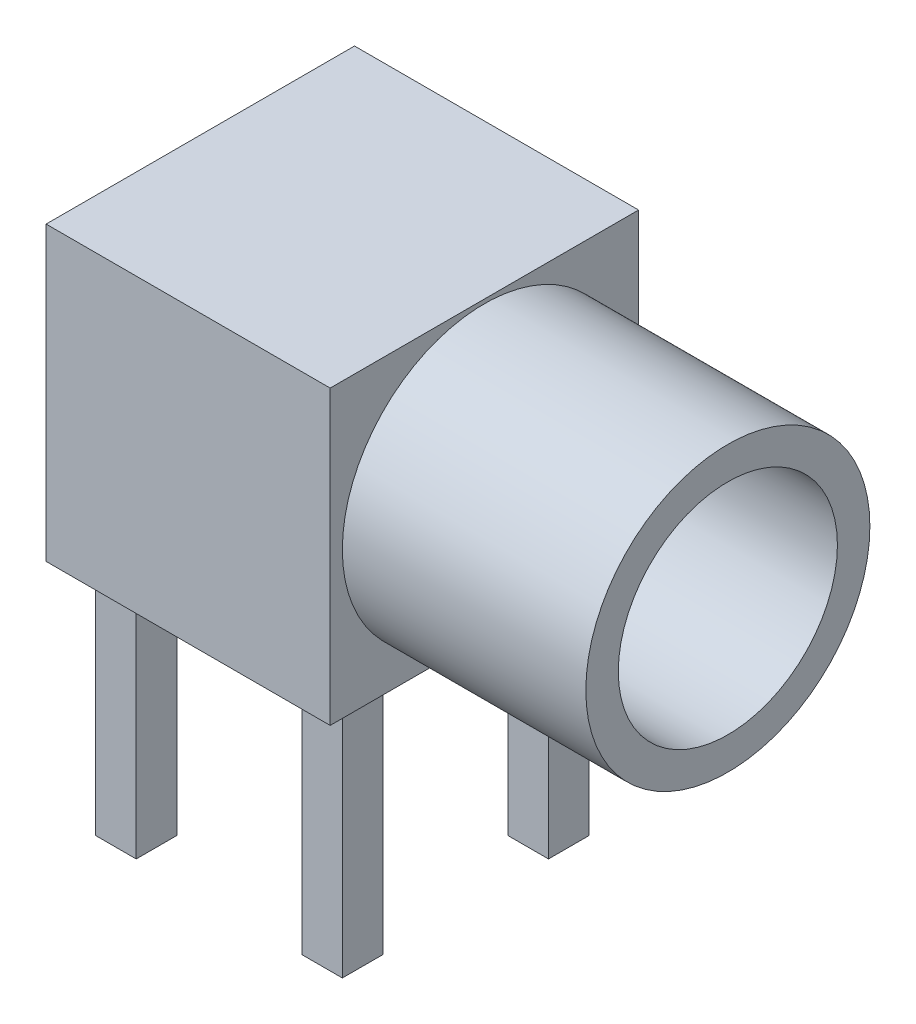
ISO-10303-21;
HEADER;
FILE_DESCRIPTION(('STEP AP214'),'2;1');
FILE_NAME('part.step','',(''),(''),'','','');
FILE_SCHEMA(('AUTOMOTIVE_DESIGN { 1 0 10303 214 1 1 1 1 }'));
ENDSEC;
DATA;
#1=APPLICATION_CONTEXT('core data for automotive mechanical design processes');
#2=APPLICATION_PROTOCOL_DEFINITION('international standard','automotive_design',2000,#1);
#3=PRODUCT_CONTEXT('',#1,'mechanical');
#4=PRODUCT('Part','Part','',(#3));
#5=PRODUCT_RELATED_PRODUCT_CATEGORY('part','',(#4));
#6=PRODUCT_DEFINITION_FORMATION('','',#4);
#7=PRODUCT_DEFINITION_CONTEXT('part definition',#1,'design');
#8=PRODUCT_DEFINITION('design','',#6,#7);
#9=PRODUCT_DEFINITION_SHAPE('','',#8);
#10=(LENGTH_UNIT() NAMED_UNIT(*) SI_UNIT(.MILLI.,.METRE.));
#11=(NAMED_UNIT(*) PLANE_ANGLE_UNIT() SI_UNIT($,.RADIAN.));
#12=(NAMED_UNIT(*) SI_UNIT($,.STERADIAN.) SOLID_ANGLE_UNIT());
#13=UNCERTAINTY_MEASURE_WITH_UNIT(LENGTH_MEASURE(1.E-05),#10,'distance_accuracy_value','');
#14=(GEOMETRIC_REPRESENTATION_CONTEXT(3) GLOBAL_UNCERTAINTY_ASSIGNED_CONTEXT((#13)) GLOBAL_UNIT_ASSIGNED_CONTEXT((#10,
#11,#12)) REPRESENTATION_CONTEXT('',''));
#15=CARTESIAN_POINT('',(0.,0.,0.));
#16=DIRECTION('',(0.,0.,1.));
#17=DIRECTION('',(1.,0.,0.));
#18=AXIS2_PLACEMENT_3D('',#15,#16,#17);
#19=CARTESIAN_POINT('',(0.,0.,0.));
#20=DIRECTION('',(0.,1.,0.));
#21=DIRECTION('',(0.,0.,1.));
#22=AXIS2_PLACEMENT_3D('',#19,#20,#21);
#23=PLANE('',#22);
#24=DIRECTION('',(0.,0.,-1.));
#25=VECTOR('',#24,1.);
#26=CARTESIAN_POINT('',(1.02,0.,1.52));
#27=LINE('',#26,#25);
#28=CARTESIAN_POINT('',(1.02,0.,1.52));
#29=VERTEX_POINT('',#28);
#30=CARTESIAN_POINT('',(1.02,0.,1.02));
#31=VERTEX_POINT('',#30);
#32=EDGE_CURVE('E204',#29,#31,#27,.T.);
#33=ORIENTED_EDGE('',*,*,#32,.F.);
#34=DIRECTION('',(-1.,0.,0.));
#35=VECTOR('',#34,1.);
#36=CARTESIAN_POINT('',(1.02,0.,1.52));
#37=LINE('',#36,#35);
#38=CARTESIAN_POINT('',(1.52,0.,1.52));
#39=VERTEX_POINT('',#38);
#40=EDGE_CURVE('E217',#39,#29,#37,.T.);
#41=ORIENTED_EDGE('',*,*,#40,.F.);
#42=DIRECTION('',(0.,0.,1.));
#43=VECTOR('',#42,1.);
#44=CARTESIAN_POINT('',(1.52,0.,1.52));
#45=LINE('',#44,#43);
#46=CARTESIAN_POINT('',(1.52,0.,1.02));
#47=VERTEX_POINT('',#46);
#48=EDGE_CURVE('E226',#47,#39,#45,.T.);
#49=ORIENTED_EDGE('',*,*,#48,.F.);
#50=DIRECTION('',(1.,0.,0.));
#51=VECTOR('',#50,1.);
#52=CARTESIAN_POINT('',(1.02,0.,1.02));
#53=LINE('',#52,#51);
#54=EDGE_CURVE('E207',#31,#47,#53,.T.);
#55=ORIENTED_EDGE('',*,*,#54,.F.);
#56=EDGE_LOOP('',(#33,#41,#49,#55));
#57=FACE_BOUND('',#56,.T.);
#58=DIRECTION('',(0.,0.,-1.));
#59=VECTOR('',#58,1.);
#60=CARTESIAN_POINT('',(-1.52,0.,1.52));
#61=LINE('',#60,#59);
#62=CARTESIAN_POINT('',(-1.52,0.,1.52));
#63=VERTEX_POINT('',#62);
#64=CARTESIAN_POINT('',(-1.52,0.,1.02));
#65=VERTEX_POINT('',#64);
#66=EDGE_CURVE('E275',#63,#65,#61,.T.);
#67=ORIENTED_EDGE('',*,*,#66,.F.);
#68=DIRECTION('',(-1.,0.,0.));
#69=VECTOR('',#68,1.);
#70=CARTESIAN_POINT('',(-1.52,0.,1.52));
#71=LINE('',#70,#69);
#72=CARTESIAN_POINT('',(-1.02,0.,1.52));
#73=VERTEX_POINT('',#72);
#74=EDGE_CURVE('E280',#73,#63,#71,.T.);
#75=ORIENTED_EDGE('',*,*,#74,.F.);
#76=DIRECTION('',(0.,0.,1.));
#77=VECTOR('',#76,1.);
#78=CARTESIAN_POINT('',(-1.02,0.,1.52));
#79=LINE('',#78,#77);
#80=CARTESIAN_POINT('',(-1.02,0.,1.02));
#81=VERTEX_POINT('',#80);
#82=EDGE_CURVE('E292',#81,#73,#79,.T.);
#83=ORIENTED_EDGE('',*,*,#82,.F.);
#84=DIRECTION('',(1.,0.,0.));
#85=VECTOR('',#84,1.);
#86=CARTESIAN_POINT('',(-1.52,0.,1.02));
#87=LINE('',#86,#85);
#88=EDGE_CURVE('E289',#65,#81,#87,.T.);
#89=ORIENTED_EDGE('',*,*,#88,.F.);
#90=EDGE_LOOP('',(#67,#75,#83,#89));
#91=FACE_BOUND('',#90,.T.);
#92=DIRECTION('',(0.,0.,-1.));
#93=VECTOR('',#92,1.);
#94=CARTESIAN_POINT('',(1.75,0.,-1.9));
#95=LINE('',#94,#93);
#96=CARTESIAN_POINT('',(1.75,0.,1.9));
#97=VERTEX_POINT('',#96);
#98=CARTESIAN_POINT('',(1.75,0.,-1.9));
#99=VERTEX_POINT('',#98);
#100=EDGE_CURVE('E317',#97,#99,#95,.T.);
#101=ORIENTED_EDGE('',*,*,#100,.F.);
#102=DIRECTION('',(1.,0.,0.));
#103=VECTOR('',#102,1.);
#104=CARTESIAN_POINT('',(-1.75,0.,1.9));
#105=LINE('',#104,#103);
#106=CARTESIAN_POINT('',(-1.75,0.,1.9));
#107=VERTEX_POINT('',#106);
#108=EDGE_CURVE('E322',#107,#97,#105,.T.);
#109=ORIENTED_EDGE('',*,*,#108,.F.);
#110=DIRECTION('',(0.,0.,1.));
#111=VECTOR('',#110,1.);
#112=CARTESIAN_POINT('',(-1.75,0.,-1.9));
#113=LINE('',#112,#111);
#114=CARTESIAN_POINT('',(-1.75,0.,-1.9));
#115=VERTEX_POINT('',#114);
#116=EDGE_CURVE('E333',#115,#107,#113,.T.);
#117=ORIENTED_EDGE('',*,*,#116,.F.);
#118=DIRECTION('',(-1.,0.,0.));
#119=VECTOR('',#118,1.);
#120=CARTESIAN_POINT('',(-1.75,0.,-1.9));
#121=LINE('',#120,#119);
#122=EDGE_CURVE('E331',#99,#115,#121,.T.);
#123=ORIENTED_EDGE('',*,*,#122,.F.);
#124=EDGE_LOOP('',(#101,#109,#117,#123));
#125=FACE_BOUND('',#124,.T.);
#126=DIRECTION('',(0.,0.,-1.));
#127=VECTOR('',#126,1.);
#128=CARTESIAN_POINT('',(-1.52,0.,-1.02));
#129=LINE('',#128,#127);
#130=CARTESIAN_POINT('',(-1.52,0.,-1.02));
#131=VERTEX_POINT('',#130);
#132=CARTESIAN_POINT('',(-1.52,0.,-1.52));
#133=VERTEX_POINT('',#132);
#134=EDGE_CURVE('E242',#131,#133,#129,.T.);
#135=ORIENTED_EDGE('',*,*,#134,.F.);
#136=DIRECTION('',(-1.,0.,0.));
#137=VECTOR('',#136,1.);
#138=CARTESIAN_POINT('',(-1.52,0.,-1.02));
#139=LINE('',#138,#137);
#140=CARTESIAN_POINT('',(-1.02,0.,-1.02));
#141=VERTEX_POINT('',#140);
#142=EDGE_CURVE('E247',#141,#131,#139,.T.);
#143=ORIENTED_EDGE('',*,*,#142,.F.);
#144=DIRECTION('',(0.,0.,1.));
#145=VECTOR('',#144,1.);
#146=CARTESIAN_POINT('',(-1.02,0.,-1.02));
#147=LINE('',#146,#145);
#148=CARTESIAN_POINT('',(-1.02,0.,-1.52));
#149=VERTEX_POINT('',#148);
#150=EDGE_CURVE('E259',#149,#141,#147,.T.);
#151=ORIENTED_EDGE('',*,*,#150,.F.);
#152=DIRECTION('',(1.,0.,0.));
#153=VECTOR('',#152,1.);
#154=CARTESIAN_POINT('',(-1.52,0.,-1.52));
#155=LINE('',#154,#153);
#156=EDGE_CURVE('E256',#133,#149,#155,.T.);
#157=ORIENTED_EDGE('',*,*,#156,.F.);
#158=EDGE_LOOP('',(#135,#143,#151,#157));
#159=FACE_BOUND('',#158,.T.);
#160=DIRECTION('',(0.,0.,-1.));
#161=VECTOR('',#160,1.);
#162=CARTESIAN_POINT('',(1.02,0.,-1.02));
#163=LINE('',#162,#161);
#164=CARTESIAN_POINT('',(1.02,0.,-1.02));
#165=VERTEX_POINT('',#164);
#166=CARTESIAN_POINT('',(1.02,0.,-1.52));
#167=VERTEX_POINT('',#166);
#168=EDGE_CURVE('E203',#165,#167,#163,.T.);
#169=ORIENTED_EDGE('',*,*,#168,.F.);
#170=DIRECTION('',(-1.,0.,0.));
#171=VECTOR('',#170,1.);
#172=CARTESIAN_POINT('',(1.02,0.,-1.02));
#173=LINE('',#172,#171);
#174=CARTESIAN_POINT('',(1.52,0.,-1.02));
#175=VERTEX_POINT('',#174);
#176=EDGE_CURVE('E200',#175,#165,#173,.T.);
#177=ORIENTED_EDGE('',*,*,#176,.F.);
#178=DIRECTION('',(0.,0.,1.));
#179=VECTOR('',#178,1.);
#180=CARTESIAN_POINT('',(1.52,0.,-1.02));
#181=LINE('',#180,#179);
#182=CARTESIAN_POINT('',(1.52,0.,-1.52));
#183=VERTEX_POINT('',#182);
#184=EDGE_CURVE('E66',#183,#175,#181,.T.);
#185=ORIENTED_EDGE('',*,*,#184,.F.);
#186=DIRECTION('',(1.,0.,0.));
#187=VECTOR('',#186,1.);
#188=CARTESIAN_POINT('',(1.02,0.,-1.52));
#189=LINE('',#188,#187);
#190=EDGE_CURVE('E61',#167,#183,#189,.T.);
#191=ORIENTED_EDGE('',*,*,#190,.F.);
#192=EDGE_LOOP('',(#169,#177,#185,#191));
#193=FACE_BOUND('',#192,.T.);
#194=ADVANCED_FACE('F46',(#57,#91,#125,#159,#193),#23,.F.);
#195=CARTESIAN_POINT('',(1.75,3.6,-1.9));
#196=DIRECTION('',(-1.,0.,0.));
#197=DIRECTION('',(0.,0.,1.));
#198=AXIS2_PLACEMENT_3D('',#195,#196,#197);
#199=PLANE('',#198);
#200=CARTESIAN_POINT('',(1.75,1.8,0.));
#201=DIRECTION('',(-1.,0.,0.));
#202=DIRECTION('',(0.,0.,1.));
#203=AXIS2_PLACEMENT_3D('',#200,#201,#202);
#204=CIRCLE('',#203,1.75);
#205=CARTESIAN_POINT('',(1.75,1.8,1.75));
#206=VERTEX_POINT('',#205);
#207=EDGE_CURVE('E13',#206,#206,#204,.F.);
#208=ORIENTED_EDGE('',*,*,#207,.F.);
#209=EDGE_LOOP('',(#208));
#210=FACE_BOUND('',#209,.T.);
#211=ORIENTED_EDGE('',*,*,#100,.T.);
#212=DIRECTION('',(0.,-1.,0.));
#213=VECTOR('',#212,1.);
#214=CARTESIAN_POINT('',(1.75,3.6,-1.9));
#215=LINE('',#214,#213);
#216=CARTESIAN_POINT('',(1.75,3.6,-1.9));
#217=VERTEX_POINT('',#216);
#218=EDGE_CURVE('E54',#217,#99,#215,.T.);
#219=ORIENTED_EDGE('',*,*,#218,.F.);
#220=DIRECTION('',(0.,0.,-1.));
#221=VECTOR('',#220,1.);
#222=CARTESIAN_POINT('',(1.75,3.6,-1.9));
#223=LINE('',#222,#221);
#224=CARTESIAN_POINT('',(1.75,3.6,1.9));
#225=VERTEX_POINT('',#224);
#226=EDGE_CURVE('E318',#225,#217,#223,.T.);
#227=ORIENTED_EDGE('',*,*,#226,.F.);
#228=DIRECTION('',(0.,-1.,0.));
#229=VECTOR('',#228,1.);
#230=CARTESIAN_POINT('',(1.75,3.6,1.9));
#231=LINE('',#230,#229);
#232=EDGE_CURVE('E328',#225,#97,#231,.T.);
#233=ORIENTED_EDGE('',*,*,#232,.T.);
#234=EDGE_LOOP('',(#211,#219,#227,#233));
#235=FACE_BOUND('',#234,.T.);
#236=ADVANCED_FACE('F48',(#210,#235),#199,.F.);
#237=CARTESIAN_POINT('',(-1.75,3.6,-1.9));
#238=DIRECTION('',(0.,0.,1.));
#239=DIRECTION('',(1.,0.,0.));
#240=AXIS2_PLACEMENT_3D('',#237,#238,#239);
#241=PLANE('',#240);
#242=ORIENTED_EDGE('',*,*,#122,.T.);
#243=DIRECTION('',(0.,-1.,0.));
#244=VECTOR('',#243,1.);
#245=CARTESIAN_POINT('',(-1.75,3.6,-1.9));
#246=LINE('',#245,#244);
#247=CARTESIAN_POINT('',(-1.75,3.6,-1.9));
#248=VERTEX_POINT('',#247);
#249=EDGE_CURVE('E341',#248,#115,#246,.T.);
#250=ORIENTED_EDGE('',*,*,#249,.F.);
#251=DIRECTION('',(-1.,0.,0.));
#252=VECTOR('',#251,1.);
#253=CARTESIAN_POINT('',(-1.75,3.6,-1.9));
#254=LINE('',#253,#252);
#255=EDGE_CURVE('E321',#217,#248,#254,.T.);
#256=ORIENTED_EDGE('',*,*,#255,.F.);
#257=ORIENTED_EDGE('',*,*,#218,.T.);
#258=EDGE_LOOP('',(#242,#250,#256,#257));
#259=FACE_BOUND('',#258,.T.);
#260=ADVANCED_FACE('F346',(#259),#241,.F.);
#261=CARTESIAN_POINT('',(-1.75,3.6,-1.9));
#262=DIRECTION('',(1.,0.,0.));
#263=DIRECTION('',(0.,0.,-1.));
#264=AXIS2_PLACEMENT_3D('',#261,#262,#263);
#265=PLANE('',#264);
#266=ORIENTED_EDGE('',*,*,#116,.T.);
#267=DIRECTION('',(0.,-1.,0.));
#268=VECTOR('',#267,1.);
#269=CARTESIAN_POINT('',(-1.75,3.6,1.9));
#270=LINE('',#269,#268);
#271=CARTESIAN_POINT('',(-1.75,3.6,1.9));
#272=VERTEX_POINT('',#271);
#273=EDGE_CURVE('E338',#272,#107,#270,.T.);
#274=ORIENTED_EDGE('',*,*,#273,.F.);
#275=DIRECTION('',(0.,0.,1.));
#276=VECTOR('',#275,1.);
#277=CARTESIAN_POINT('',(-1.75,3.6,-1.9));
#278=LINE('',#277,#276);
#279=EDGE_CURVE('E324',#248,#272,#278,.T.);
#280=ORIENTED_EDGE('',*,*,#279,.F.);
#281=ORIENTED_EDGE('',*,*,#249,.T.);
#282=EDGE_LOOP('',(#266,#274,#280,#281));
#283=FACE_BOUND('',#282,.T.);
#284=ADVANCED_FACE('F358',(#283),#265,.F.);
#285=CARTESIAN_POINT('',(-1.75,3.6,1.9));
#286=DIRECTION('',(0.,0.,-1.));
#287=DIRECTION('',(-1.,0.,0.));
#288=AXIS2_PLACEMENT_3D('',#285,#286,#287);
#289=PLANE('',#288);
#290=ORIENTED_EDGE('',*,*,#108,.T.);
#291=ORIENTED_EDGE('',*,*,#232,.F.);
#292=DIRECTION('',(1.,0.,0.));
#293=VECTOR('',#292,1.);
#294=CARTESIAN_POINT('',(-1.75,3.6,1.9));
#295=LINE('',#294,#293);
#296=EDGE_CURVE('E326',#272,#225,#295,.T.);
#297=ORIENTED_EDGE('',*,*,#296,.F.);
#298=ORIENTED_EDGE('',*,*,#273,.T.);
#299=EDGE_LOOP('',(#290,#291,#297,#298));
#300=FACE_BOUND('',#299,.T.);
#301=ADVANCED_FACE('F362',(#300),#289,.F.);
#302=CARTESIAN_POINT('',(0.,3.6,0.));
#303=DIRECTION('',(0.,1.,0.));
#304=DIRECTION('',(0.,0.,1.));
#305=AXIS2_PLACEMENT_3D('',#302,#303,#304);
#306=PLANE('',#305);
#307=ORIENTED_EDGE('',*,*,#226,.T.);
#308=ORIENTED_EDGE('',*,*,#255,.T.);
#309=ORIENTED_EDGE('',*,*,#279,.T.);
#310=ORIENTED_EDGE('',*,*,#296,.T.);
#311=EDGE_LOOP('',(#307,#308,#309,#310));
#312=FACE_BOUND('',#311,.T.);
#313=ADVANCED_FACE('F364',(#312),#306,.T.);
#314=CARTESIAN_POINT('',(4.75,1.8,0.));
#315=DIRECTION('',(1.,0.,0.));
#316=DIRECTION('',(0.,0.,-1.));
#317=AXIS2_PLACEMENT_3D('',#314,#315,#316);
#318=PLANE('',#317);
#319=CARTESIAN_POINT('',(4.75,1.8,0.));
#320=DIRECTION('',(1.,0.,0.));
#321=DIRECTION('',(0.,0.,-1.));
#322=AXIS2_PLACEMENT_3D('',#319,#320,#321);
#323=CIRCLE('',#322,1.75);
#324=CARTESIAN_POINT('',(4.75,1.8,-1.75));
#325=VERTEX_POINT('',#324);
#326=EDGE_CURVE('E312',#325,#325,#323,.T.);
#327=ORIENTED_EDGE('',*,*,#326,.T.);
#328=EDGE_LOOP('',(#327));
#329=FACE_BOUND('',#328,.T.);
#330=CARTESIAN_POINT('',(4.75,1.8,0.));
#331=DIRECTION('',(1.,0.,0.));
#332=DIRECTION('',(0.,0.,-1.));
#333=AXIS2_PLACEMENT_3D('',#330,#331,#332);
#334=CIRCLE('',#333,1.35);
#335=CARTESIAN_POINT('',(4.75,1.8,-1.35));
#336=VERTEX_POINT('',#335);
#337=EDGE_CURVE('E309',#336,#336,#334,.T.);
#338=ORIENTED_EDGE('',*,*,#337,.F.);
#339=EDGE_LOOP('',(#338));
#340=FACE_BOUND('',#339,.T.);
#341=ADVANCED_FACE('F366',(#329,#340),#318,.T.);
#342=CARTESIAN_POINT('',(4.75,1.8,0.));
#343=DIRECTION('',(-1.,0.,0.));
#344=DIRECTION('',(0.,0.,1.));
#345=AXIS2_PLACEMENT_3D('',#342,#343,#344);
#346=CYLINDRICAL_SURFACE('',#345,1.75);
#347=ORIENTED_EDGE('',*,*,#326,.F.);
#348=EDGE_LOOP('',(#347));
#349=FACE_BOUND('',#348,.T.);
#350=ORIENTED_EDGE('',*,*,#207,.T.);
#351=EDGE_LOOP('',(#350));
#352=FACE_BOUND('',#351,.T.);
#353=ADVANCED_FACE('F372',(#349,#352),#346,.T.);
#354=CARTESIAN_POINT('',(4.75,1.8,0.));
#355=DIRECTION('',(-1.,0.,0.));
#356=DIRECTION('',(0.,0.,1.));
#357=AXIS2_PLACEMENT_3D('',#354,#355,#356);
#358=CYLINDRICAL_SURFACE('',#357,1.35);
#359=ORIENTED_EDGE('',*,*,#337,.T.);
#360=EDGE_LOOP('',(#359));
#361=FACE_BOUND('',#360,.T.);
#362=CARTESIAN_POINT('',(1.75,1.8,0.));
#363=DIRECTION('',(1.,0.,0.));
#364=DIRECTION('',(0.,0.,-1.));
#365=AXIS2_PLACEMENT_3D('',#362,#363,#364);
#366=CIRCLE('',#365,1.35);
#367=CARTESIAN_POINT('',(1.75,1.8,-1.35));
#368=VERTEX_POINT('',#367);
#369=EDGE_CURVE('E308',#368,#368,#366,.T.);
#370=ORIENTED_EDGE('',*,*,#369,.F.);
#371=EDGE_LOOP('',(#370));
#372=FACE_BOUND('',#371,.T.);
#373=ADVANCED_FACE('F425',(#361,#372),#358,.F.);
#374=ORIENTED_EDGE('',*,*,#369,.T.);
#375=EDGE_LOOP('',(#374));
#376=FACE_BOUND('',#375,.T.);
#377=ADVANCED_FACE('F384',(#376),#199,.F.);
#378=CARTESIAN_POINT('',(-1.52,-3.,1.52));
#379=DIRECTION('',(1.,0.,0.));
#380=DIRECTION('',(0.,0.,-1.));
#381=AXIS2_PLACEMENT_3D('',#378,#379,#380);
#382=PLANE('',#381);
#383=ORIENTED_EDGE('',*,*,#66,.T.);
#384=DIRECTION('',(0.,1.,0.));
#385=VECTOR('',#384,1.);
#386=CARTESIAN_POINT('',(-1.52,-3.,1.02));
#387=LINE('',#386,#385);
#388=CARTESIAN_POINT('',(-1.52,-3.,1.02));
#389=VERTEX_POINT('',#388);
#390=EDGE_CURVE('E305',#389,#65,#387,.T.);
#391=ORIENTED_EDGE('',*,*,#390,.F.);
#392=DIRECTION('',(0.,0.,-1.));
#393=VECTOR('',#392,1.);
#394=CARTESIAN_POINT('',(-1.52,-3.,1.52));
#395=LINE('',#394,#393);
#396=CARTESIAN_POINT('',(-1.52,-3.,1.52));
#397=VERTEX_POINT('',#396);
#398=EDGE_CURVE('E276',#397,#389,#395,.T.);
#399=ORIENTED_EDGE('',*,*,#398,.F.);
#400=DIRECTION('',(0.,1.,0.));
#401=VECTOR('',#400,1.);
#402=CARTESIAN_POINT('',(-1.52,-3.,1.52));
#403=LINE('',#402,#401);
#404=EDGE_CURVE('E286',#397,#63,#403,.T.);
#405=ORIENTED_EDGE('',*,*,#404,.T.);
#406=EDGE_LOOP('',(#383,#391,#399,#405));
#407=FACE_BOUND('',#406,.T.);
#408=ADVANCED_FACE('F442',(#407),#382,.F.);
#409=CARTESIAN_POINT('',(-1.52,-3.,1.02));
#410=DIRECTION('',(0.,0.,1.));
#411=DIRECTION('',(1.,0.,0.));
#412=AXIS2_PLACEMENT_3D('',#409,#410,#411);
#413=PLANE('',#412);
#414=ORIENTED_EDGE('',*,*,#88,.T.);
#415=DIRECTION('',(0.,1.,0.));
#416=VECTOR('',#415,1.);
#417=CARTESIAN_POINT('',(-1.02,-3.,1.02));
#418=LINE('',#417,#416);
#419=CARTESIAN_POINT('',(-1.02,-3.,1.02));
#420=VERTEX_POINT('',#419);
#421=EDGE_CURVE('E302',#420,#81,#418,.T.);
#422=ORIENTED_EDGE('',*,*,#421,.F.);
#423=DIRECTION('',(1.,0.,0.));
#424=VECTOR('',#423,1.);
#425=CARTESIAN_POINT('',(-1.52,-3.,1.02));
#426=LINE('',#425,#424);
#427=EDGE_CURVE('E279',#389,#420,#426,.T.);
#428=ORIENTED_EDGE('',*,*,#427,.F.);
#429=ORIENTED_EDGE('',*,*,#390,.T.);
#430=EDGE_LOOP('',(#414,#422,#428,#429));
#431=FACE_BOUND('',#430,.T.);
#432=ADVANCED_FACE('F455',(#431),#413,.F.);
#433=CARTESIAN_POINT('',(-1.02,-3.,1.52));
#434=DIRECTION('',(-1.,0.,0.));
#435=DIRECTION('',(0.,0.,1.));
#436=AXIS2_PLACEMENT_3D('',#433,#434,#435);
#437=PLANE('',#436);
#438=ORIENTED_EDGE('',*,*,#82,.T.);
#439=DIRECTION('',(0.,1.,0.));
#440=VECTOR('',#439,1.);
#441=CARTESIAN_POINT('',(-1.02,-3.,1.52));
#442=LINE('',#441,#440);
#443=CARTESIAN_POINT('',(-1.02,-3.,1.52));
#444=VERTEX_POINT('',#443);
#445=EDGE_CURVE('E299',#444,#73,#442,.T.);
#446=ORIENTED_EDGE('',*,*,#445,.F.);
#447=DIRECTION('',(0.,0.,1.));
#448=VECTOR('',#447,1.);
#449=CARTESIAN_POINT('',(-1.02,-3.,1.52));
#450=LINE('',#449,#448);
#451=EDGE_CURVE('E282',#420,#444,#450,.T.);
#452=ORIENTED_EDGE('',*,*,#451,.F.);
#453=ORIENTED_EDGE('',*,*,#421,.T.);
#454=EDGE_LOOP('',(#438,#446,#452,#453));
#455=FACE_BOUND('',#454,.T.);
#456=ADVANCED_FACE('F465',(#455),#437,.F.);
#457=CARTESIAN_POINT('',(-1.52,-3.,1.52));
#458=DIRECTION('',(0.,0.,-1.));
#459=DIRECTION('',(-1.,0.,0.));
#460=AXIS2_PLACEMENT_3D('',#457,#458,#459);
#461=PLANE('',#460);
#462=ORIENTED_EDGE('',*,*,#74,.T.);
#463=ORIENTED_EDGE('',*,*,#404,.F.);
#464=DIRECTION('',(-1.,0.,0.));
#465=VECTOR('',#464,1.);
#466=CARTESIAN_POINT('',(-1.52,-3.,1.52));
#467=LINE('',#466,#465);
#468=EDGE_CURVE('E284',#444,#397,#467,.T.);
#469=ORIENTED_EDGE('',*,*,#468,.F.);
#470=ORIENTED_EDGE('',*,*,#445,.T.);
#471=EDGE_LOOP('',(#462,#463,#469,#470));
#472=FACE_BOUND('',#471,.T.);
#473=ADVANCED_FACE('F475',(#472),#461,.F.);
#474=CARTESIAN_POINT('',(0.,-3.,0.));
#475=DIRECTION('',(0.,-1.,0.));
#476=DIRECTION('',(0.,0.,-1.));
#477=AXIS2_PLACEMENT_3D('',#474,#475,#476);
#478=PLANE('',#477);
#479=ORIENTED_EDGE('',*,*,#398,.T.);
#480=ORIENTED_EDGE('',*,*,#427,.T.);
#481=ORIENTED_EDGE('',*,*,#451,.T.);
#482=ORIENTED_EDGE('',*,*,#468,.T.);
#483=EDGE_LOOP('',(#479,#480,#481,#482));
#484=FACE_BOUND('',#483,.T.);
#485=ADVANCED_FACE('F485',(#484),#478,.T.);
#486=CARTESIAN_POINT('',(-1.52,-3.,-1.02));
#487=DIRECTION('',(1.,0.,0.));
#488=DIRECTION('',(0.,0.,-1.));
#489=AXIS2_PLACEMENT_3D('',#486,#487,#488);
#490=PLANE('',#489);
#491=ORIENTED_EDGE('',*,*,#134,.T.);
#492=DIRECTION('',(0.,1.,0.));
#493=VECTOR('',#492,1.);
#494=CARTESIAN_POINT('',(-1.52,-3.,-1.52));
#495=LINE('',#494,#493);
#496=CARTESIAN_POINT('',(-1.52,-3.,-1.52));
#497=VERTEX_POINT('',#496);
#498=EDGE_CURVE('E272',#497,#133,#495,.T.);
#499=ORIENTED_EDGE('',*,*,#498,.F.);
#500=DIRECTION('',(0.,0.,-1.));
#501=VECTOR('',#500,1.);
#502=CARTESIAN_POINT('',(-1.52,-3.,-1.02));
#503=LINE('',#502,#501);
#504=CARTESIAN_POINT('',(-1.52,-3.,-1.02));
#505=VERTEX_POINT('',#504);
#506=EDGE_CURVE('E243',#505,#497,#503,.T.);
#507=ORIENTED_EDGE('',*,*,#506,.F.);
#508=DIRECTION('',(0.,1.,0.));
#509=VECTOR('',#508,1.);
#510=CARTESIAN_POINT('',(-1.52,-3.,-1.02));
#511=LINE('',#510,#509);
#512=EDGE_CURVE('E253',#505,#131,#511,.T.);
#513=ORIENTED_EDGE('',*,*,#512,.T.);
#514=EDGE_LOOP('',(#491,#499,#507,#513));
#515=FACE_BOUND('',#514,.T.);
#516=ADVANCED_FACE('F495',(#515),#490,.F.);
#517=CARTESIAN_POINT('',(-1.52,-3.,-1.52));
#518=DIRECTION('',(0.,0.,1.));
#519=DIRECTION('',(1.,0.,0.));
#520=AXIS2_PLACEMENT_3D('',#517,#518,#519);
#521=PLANE('',#520);
#522=ORIENTED_EDGE('',*,*,#156,.T.);
#523=DIRECTION('',(0.,1.,0.));
#524=VECTOR('',#523,1.);
#525=CARTESIAN_POINT('',(-1.02,-3.,-1.52));
#526=LINE('',#525,#524);
#527=CARTESIAN_POINT('',(-1.02,-3.,-1.52));
#528=VERTEX_POINT('',#527);
#529=EDGE_CURVE('E269',#528,#149,#526,.T.);
#530=ORIENTED_EDGE('',*,*,#529,.F.);
#531=DIRECTION('',(1.,0.,0.));
#532=VECTOR('',#531,1.);
#533=CARTESIAN_POINT('',(-1.52,-3.,-1.52));
#534=LINE('',#533,#532);
#535=EDGE_CURVE('E246',#497,#528,#534,.T.);
#536=ORIENTED_EDGE('',*,*,#535,.F.);
#537=ORIENTED_EDGE('',*,*,#498,.T.);
#538=EDGE_LOOP('',(#522,#530,#536,#537));
#539=FACE_BOUND('',#538,.T.);
#540=ADVANCED_FACE('F505',(#539),#521,.F.);
#541=CARTESIAN_POINT('',(-1.02,-3.,-1.02));
#542=DIRECTION('',(-1.,0.,0.));
#543=DIRECTION('',(0.,0.,1.));
#544=AXIS2_PLACEMENT_3D('',#541,#542,#543);
#545=PLANE('',#544);
#546=ORIENTED_EDGE('',*,*,#150,.T.);
#547=DIRECTION('',(0.,1.,0.));
#548=VECTOR('',#547,1.);
#549=CARTESIAN_POINT('',(-1.02,-3.,-1.02));
#550=LINE('',#549,#548);
#551=CARTESIAN_POINT('',(-1.02,-3.,-1.02));
#552=VERTEX_POINT('',#551);
#553=EDGE_CURVE('E266',#552,#141,#550,.T.);
#554=ORIENTED_EDGE('',*,*,#553,.F.);
#555=DIRECTION('',(0.,0.,1.));
#556=VECTOR('',#555,1.);
#557=CARTESIAN_POINT('',(-1.02,-3.,-1.02));
#558=LINE('',#557,#556);
#559=EDGE_CURVE('E249',#528,#552,#558,.T.);
#560=ORIENTED_EDGE('',*,*,#559,.F.);
#561=ORIENTED_EDGE('',*,*,#529,.T.);
#562=EDGE_LOOP('',(#546,#554,#560,#561));
#563=FACE_BOUND('',#562,.T.);
#564=ADVANCED_FACE('F515',(#563),#545,.F.);
#565=CARTESIAN_POINT('',(-1.52,-3.,-1.02));
#566=DIRECTION('',(0.,0.,-1.));
#567=DIRECTION('',(-1.,0.,0.));
#568=AXIS2_PLACEMENT_3D('',#565,#566,#567);
#569=PLANE('',#568);
#570=ORIENTED_EDGE('',*,*,#142,.T.);
#571=ORIENTED_EDGE('',*,*,#512,.F.);
#572=DIRECTION('',(-1.,0.,0.));
#573=VECTOR('',#572,1.);
#574=CARTESIAN_POINT('',(-1.52,-3.,-1.02));
#575=LINE('',#574,#573);
#576=EDGE_CURVE('E251',#552,#505,#575,.T.);
#577=ORIENTED_EDGE('',*,*,#576,.F.);
#578=ORIENTED_EDGE('',*,*,#553,.T.);
#579=EDGE_LOOP('',(#570,#571,#577,#578));
#580=FACE_BOUND('',#579,.T.);
#581=ADVANCED_FACE('F525',(#580),#569,.F.);
#582=CARTESIAN_POINT('',(0.,-3.,0.));
#583=DIRECTION('',(0.,-1.,0.));
#584=DIRECTION('',(0.,0.,-1.));
#585=AXIS2_PLACEMENT_3D('',#582,#583,#584);
#586=PLANE('',#585);
#587=ORIENTED_EDGE('',*,*,#506,.T.);
#588=ORIENTED_EDGE('',*,*,#535,.T.);
#589=ORIENTED_EDGE('',*,*,#559,.T.);
#590=ORIENTED_EDGE('',*,*,#576,.T.);
#591=EDGE_LOOP('',(#587,#588,#589,#590));
#592=FACE_BOUND('',#591,.T.);
#593=ADVANCED_FACE('F535',(#592),#586,.T.);
#594=CARTESIAN_POINT('',(1.02,-3.,1.52));
#595=DIRECTION('',(1.,0.,0.));
#596=DIRECTION('',(0.,0.,-1.));
#597=AXIS2_PLACEMENT_3D('',#594,#595,#596);
#598=PLANE('',#597);
#599=ORIENTED_EDGE('',*,*,#32,.T.);
#600=DIRECTION('',(0.,1.,0.));
#601=VECTOR('',#600,1.);
#602=CARTESIAN_POINT('',(1.02,-3.,1.02));
#603=LINE('',#602,#601);
#604=CARTESIAN_POINT('',(1.02,-3.,1.02));
#605=VERTEX_POINT('',#604);
#606=EDGE_CURVE('E239',#605,#31,#603,.T.);
#607=ORIENTED_EDGE('',*,*,#606,.F.);
#608=DIRECTION('',(0.,0.,-1.));
#609=VECTOR('',#608,1.);
#610=CARTESIAN_POINT('',(1.02,-3.,1.52));
#611=LINE('',#610,#609);
#612=CARTESIAN_POINT('',(1.02,-3.,1.52));
#613=VERTEX_POINT('',#612);
#614=EDGE_CURVE('E213',#613,#605,#611,.T.);
#615=ORIENTED_EDGE('',*,*,#614,.F.);
#616=DIRECTION('',(0.,1.,0.));
#617=VECTOR('',#616,1.);
#618=CARTESIAN_POINT('',(1.02,-3.,1.52));
#619=LINE('',#618,#617);
#620=EDGE_CURVE('E222',#613,#29,#619,.T.);
#621=ORIENTED_EDGE('',*,*,#620,.T.);
#622=EDGE_LOOP('',(#599,#607,#615,#621));
#623=FACE_BOUND('',#622,.T.);
#624=ADVANCED_FACE('F545',(#623),#598,.F.);
#625=CARTESIAN_POINT('',(1.02,-3.,1.02));
#626=DIRECTION('',(0.,0.,1.));
#627=DIRECTION('',(1.,0.,0.));
#628=AXIS2_PLACEMENT_3D('',#625,#626,#627);
#629=PLANE('',#628);
#630=ORIENTED_EDGE('',*,*,#54,.T.);
#631=DIRECTION('',(0.,1.,0.));
#632=VECTOR('',#631,1.);
#633=CARTESIAN_POINT('',(1.52,-3.,1.02));
#634=LINE('',#633,#632);
#635=CARTESIAN_POINT('',(1.52,-3.,1.02));
#636=VERTEX_POINT('',#635);
#637=EDGE_CURVE('E236',#636,#47,#634,.T.);
#638=ORIENTED_EDGE('',*,*,#637,.F.);
#639=DIRECTION('',(1.,0.,0.));
#640=VECTOR('',#639,1.);
#641=CARTESIAN_POINT('',(1.02,-3.,1.02));
#642=LINE('',#641,#640);
#643=EDGE_CURVE('E216',#605,#636,#642,.T.);
#644=ORIENTED_EDGE('',*,*,#643,.F.);
#645=ORIENTED_EDGE('',*,*,#606,.T.);
#646=EDGE_LOOP('',(#630,#638,#644,#645));
#647=FACE_BOUND('',#646,.T.);
#648=ADVANCED_FACE('F555',(#647),#629,.F.);
#649=CARTESIAN_POINT('',(1.52,-3.,1.52));
#650=DIRECTION('',(-1.,0.,0.));
#651=DIRECTION('',(0.,0.,1.));
#652=AXIS2_PLACEMENT_3D('',#649,#650,#651);
#653=PLANE('',#652);
#654=ORIENTED_EDGE('',*,*,#48,.T.);
#655=DIRECTION('',(0.,1.,0.));
#656=VECTOR('',#655,1.);
#657=CARTESIAN_POINT('',(1.52,-3.,1.52));
#658=LINE('',#657,#656);
#659=CARTESIAN_POINT('',(1.52,-3.,1.52));
#660=VERTEX_POINT('',#659);
#661=EDGE_CURVE('E233',#660,#39,#658,.T.);
#662=ORIENTED_EDGE('',*,*,#661,.F.);
#663=DIRECTION('',(0.,0.,1.));
#664=VECTOR('',#663,1.);
#665=CARTESIAN_POINT('',(1.52,-3.,1.52));
#666=LINE('',#665,#664);
#667=EDGE_CURVE('E219',#636,#660,#666,.T.);
#668=ORIENTED_EDGE('',*,*,#667,.F.);
#669=ORIENTED_EDGE('',*,*,#637,.T.);
#670=EDGE_LOOP('',(#654,#662,#668,#669));
#671=FACE_BOUND('',#670,.T.);
#672=ADVANCED_FACE('F565',(#671),#653,.F.);
#673=CARTESIAN_POINT('',(1.02,-3.,1.52));
#674=DIRECTION('',(0.,0.,-1.));
#675=DIRECTION('',(-1.,0.,0.));
#676=AXIS2_PLACEMENT_3D('',#673,#674,#675);
#677=PLANE('',#676);
#678=ORIENTED_EDGE('',*,*,#40,.T.);
#679=ORIENTED_EDGE('',*,*,#620,.F.);
#680=DIRECTION('',(-1.,0.,0.));
#681=VECTOR('',#680,1.);
#682=CARTESIAN_POINT('',(1.02,-3.,1.52));
#683=LINE('',#682,#681);
#684=EDGE_CURVE('E221',#660,#613,#683,.T.);
#685=ORIENTED_EDGE('',*,*,#684,.F.);
#686=ORIENTED_EDGE('',*,*,#661,.T.);
#687=EDGE_LOOP('',(#678,#679,#685,#686));
#688=FACE_BOUND('',#687,.T.);
#689=ADVANCED_FACE('F575',(#688),#677,.F.);
#690=CARTESIAN_POINT('',(0.,-3.,0.));
#691=DIRECTION('',(0.,-1.,0.));
#692=DIRECTION('',(0.,0.,-1.));
#693=AXIS2_PLACEMENT_3D('',#690,#691,#692);
#694=PLANE('',#693);
#695=ORIENTED_EDGE('',*,*,#614,.T.);
#696=ORIENTED_EDGE('',*,*,#643,.T.);
#697=ORIENTED_EDGE('',*,*,#667,.T.);
#698=ORIENTED_EDGE('',*,*,#684,.T.);
#699=EDGE_LOOP('',(#695,#696,#697,#698));
#700=FACE_BOUND('',#699,.T.);
#701=ADVANCED_FACE('F585',(#700),#694,.T.);
#702=CARTESIAN_POINT('',(1.02,-3.,-1.02));
#703=DIRECTION('',(1.,0.,0.));
#704=DIRECTION('',(0.,0.,-1.));
#705=AXIS2_PLACEMENT_3D('',#702,#703,#704);
#706=PLANE('',#705);
#707=ORIENTED_EDGE('',*,*,#168,.T.);
#708=DIRECTION('',(0.,1.,0.));
#709=VECTOR('',#708,1.);
#710=CARTESIAN_POINT('',(1.02,-3.,-1.52));
#711=LINE('',#710,#709);
#712=CARTESIAN_POINT('',(1.02,-3.,-1.52));
#713=VERTEX_POINT('',#712);
#714=EDGE_CURVE('E184',#713,#167,#711,.T.);
#715=ORIENTED_EDGE('',*,*,#714,.F.);
#716=DIRECTION('',(0.,0.,-1.));
#717=VECTOR('',#716,1.);
#718=CARTESIAN_POINT('',(1.02,-3.,-1.02));
#719=LINE('',#718,#717);
#720=CARTESIAN_POINT('',(1.02,-3.,-1.02));
#721=VERTEX_POINT('',#720);
#722=EDGE_CURVE('E191',#721,#713,#719,.T.);
#723=ORIENTED_EDGE('',*,*,#722,.F.);
#724=DIRECTION('',(0.,1.,0.));
#725=VECTOR('',#724,1.);
#726=CARTESIAN_POINT('',(1.02,-3.,-1.02));
#727=LINE('',#726,#725);
#728=EDGE_CURVE('E645',#721,#165,#727,.T.);
#729=ORIENTED_EDGE('',*,*,#728,.T.);
#730=EDGE_LOOP('',(#707,#715,#723,#729));
#731=FACE_BOUND('',#730,.T.);
#732=ADVANCED_FACE('F202',(#731),#706,.F.);
#733=CARTESIAN_POINT('',(1.02,-3.,-1.52));
#734=DIRECTION('',(0.,0.,1.));
#735=DIRECTION('',(1.,0.,0.));
#736=AXIS2_PLACEMENT_3D('',#733,#734,#735);
#737=PLANE('',#736);
#738=ORIENTED_EDGE('',*,*,#190,.T.);
#739=DIRECTION('',(0.,1.,0.));
#740=VECTOR('',#739,1.);
#741=CARTESIAN_POINT('',(1.52,-3.,-1.52));
#742=LINE('',#741,#740);
#743=CARTESIAN_POINT('',(1.52,-3.,-1.52));
#744=VERTEX_POINT('',#743);
#745=EDGE_CURVE('E187',#744,#183,#742,.T.);
#746=ORIENTED_EDGE('',*,*,#745,.F.);
#747=DIRECTION('',(1.,0.,0.));
#748=VECTOR('',#747,1.);
#749=CARTESIAN_POINT('',(1.02,-3.,-1.52));
#750=LINE('',#749,#748);
#751=EDGE_CURVE('E180',#713,#744,#750,.T.);
#752=ORIENTED_EDGE('',*,*,#751,.F.);
#753=ORIENTED_EDGE('',*,*,#714,.T.);
#754=EDGE_LOOP('',(#738,#746,#752,#753));
#755=FACE_BOUND('',#754,.T.);
#756=ADVANCED_FACE('F182',(#755),#737,.F.);
#757=CARTESIAN_POINT('',(1.52,-3.,-1.02));
#758=DIRECTION('',(-1.,0.,0.));
#759=DIRECTION('',(0.,0.,1.));
#760=AXIS2_PLACEMENT_3D('',#757,#758,#759);
#761=PLANE('',#760);
#762=ORIENTED_EDGE('',*,*,#184,.T.);
#763=DIRECTION('',(0.,1.,0.));
#764=VECTOR('',#763,1.);
#765=CARTESIAN_POINT('',(1.52,-3.,-1.02));
#766=LINE('',#765,#764);
#767=CARTESIAN_POINT('',(1.52,-3.,-1.02));
#768=VERTEX_POINT('',#767);
#769=EDGE_CURVE('E209',#768,#175,#766,.T.);
#770=ORIENTED_EDGE('',*,*,#769,.F.);
#771=DIRECTION('',(0.,0.,1.));
#772=VECTOR('',#771,1.);
#773=CARTESIAN_POINT('',(1.52,-3.,-1.02));
#774=LINE('',#773,#772);
#775=EDGE_CURVE('E190',#744,#768,#774,.T.);
#776=ORIENTED_EDGE('',*,*,#775,.F.);
#777=ORIENTED_EDGE('',*,*,#745,.T.);
#778=EDGE_LOOP('',(#762,#770,#776,#777));
#779=FACE_BOUND('',#778,.T.);
#780=ADVANCED_FACE('F612',(#779),#761,.F.);
#781=CARTESIAN_POINT('',(1.02,-3.,-1.02));
#782=DIRECTION('',(0.,0.,-1.));
#783=DIRECTION('',(-1.,0.,0.));
#784=AXIS2_PLACEMENT_3D('',#781,#782,#783);
#785=PLANE('',#784);
#786=ORIENTED_EDGE('',*,*,#176,.T.);
#787=ORIENTED_EDGE('',*,*,#728,.F.);
#788=DIRECTION('',(-1.,0.,0.));
#789=VECTOR('',#788,1.);
#790=CARTESIAN_POINT('',(1.02,-3.,-1.02));
#791=LINE('',#790,#789);
#792=EDGE_CURVE('E196',#768,#721,#791,.T.);
#793=ORIENTED_EDGE('',*,*,#792,.F.);
#794=ORIENTED_EDGE('',*,*,#769,.T.);
#795=EDGE_LOOP('',(#786,#787,#793,#794));
#796=FACE_BOUND('',#795,.T.);
#797=ADVANCED_FACE('F621',(#796),#785,.F.);
#798=CARTESIAN_POINT('',(0.,-3.,0.));
#799=DIRECTION('',(0.,-1.,0.));
#800=DIRECTION('',(0.,0.,-1.));
#801=AXIS2_PLACEMENT_3D('',#798,#799,#800);
#802=PLANE('',#801);
#803=ORIENTED_EDGE('',*,*,#722,.T.);
#804=ORIENTED_EDGE('',*,*,#751,.T.);
#805=ORIENTED_EDGE('',*,*,#775,.T.);
#806=ORIENTED_EDGE('',*,*,#792,.T.);
#807=EDGE_LOOP('',(#803,#804,#805,#806));
#808=FACE_BOUND('',#807,.T.);
#809=ADVANCED_FACE('F194',(#808),#802,.T.);
#810=CLOSED_SHELL('',(#194,#236,#260,#284,#301,#313,#341,#353,#373,#377,#408,#432,#456,#473,
#485,#516,#540,#564,#581,#593,#624,#648,#672,#689,#701,#732,#756,#780,#797,#809));
#811=MANIFOLD_SOLID_BREP('B2',#810);
#812=ADVANCED_BREP_SHAPE_REPRESENTATION('',(#18,#811),#14);
#813=SHAPE_DEFINITION_REPRESENTATION(#9,#812);
ENDSEC;
END-ISO-10303-21;
